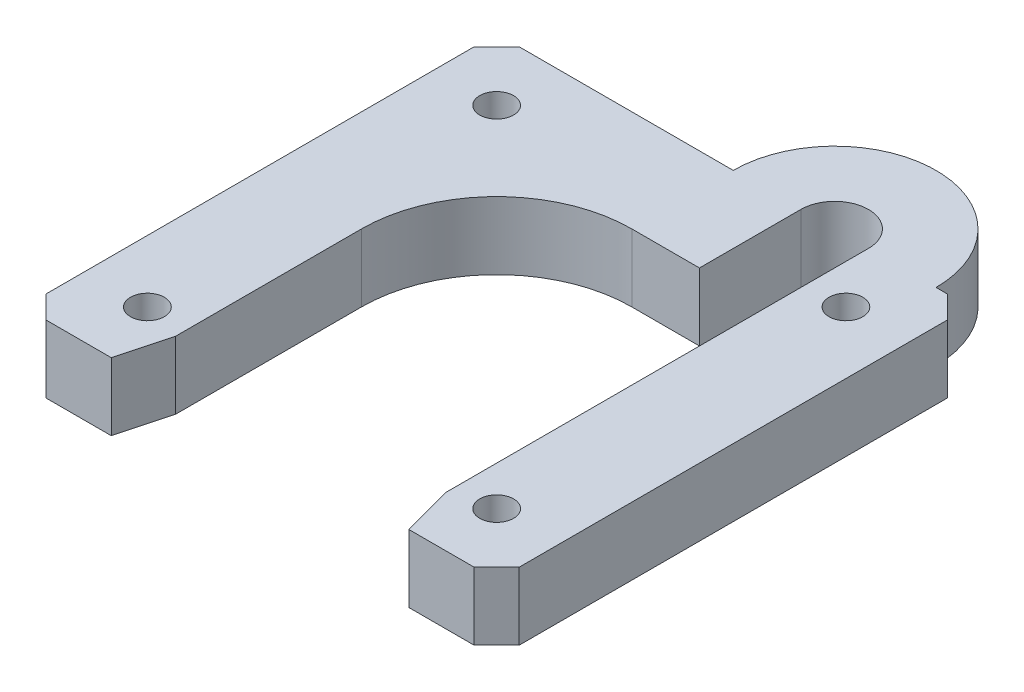
ISO-10303-21;
HEADER;
FILE_DESCRIPTION(('STEP AP214'),'2;1');
FILE_NAME('part.step','',(''),(''),'','','');
FILE_SCHEMA(('AUTOMOTIVE_DESIGN { 1 0 10303 214 1 1 1 1 }'));
ENDSEC;
DATA;
#1=APPLICATION_CONTEXT('core data for automotive mechanical design processes');
#2=APPLICATION_PROTOCOL_DEFINITION('international standard','automotive_design',2000,#1);
#3=PRODUCT_CONTEXT('',#1,'mechanical');
#4=PRODUCT('Part','Part','',(#3));
#5=PRODUCT_RELATED_PRODUCT_CATEGORY('part','',(#4));
#6=PRODUCT_DEFINITION_FORMATION('','',#4);
#7=PRODUCT_DEFINITION_CONTEXT('part definition',#1,'design');
#8=PRODUCT_DEFINITION('design','',#6,#7);
#9=PRODUCT_DEFINITION_SHAPE('','',#8);
#10=(LENGTH_UNIT() NAMED_UNIT(*) SI_UNIT(.MILLI.,.METRE.));
#11=(NAMED_UNIT(*) PLANE_ANGLE_UNIT() SI_UNIT($,.RADIAN.));
#12=(NAMED_UNIT(*) SI_UNIT($,.STERADIAN.) SOLID_ANGLE_UNIT());
#13=UNCERTAINTY_MEASURE_WITH_UNIT(LENGTH_MEASURE(1.E-05),#10,'distance_accuracy_value','');
#14=(GEOMETRIC_REPRESENTATION_CONTEXT(3) GLOBAL_UNCERTAINTY_ASSIGNED_CONTEXT((#13)) GLOBAL_UNIT_ASSIGNED_CONTEXT((#10,
#11,#12)) REPRESENTATION_CONTEXT('',''));
#15=CARTESIAN_POINT('',(0.,0.,0.));
#16=DIRECTION('',(0.,0.,1.));
#17=DIRECTION('',(1.,0.,0.));
#18=AXIS2_PLACEMENT_3D('',#15,#16,#17);
#19=CARTESIAN_POINT('',(-21.,6.,-21.));
#20=DIRECTION('',(0.,0.,1.));
#21=DIRECTION('',(1.,0.,0.));
#22=AXIS2_PLACEMENT_3D('',#19,#20,#21);
#23=PLANE('',#22);
#24=DIRECTION('',(-1.,0.,0.));
#25=VECTOR('',#24,1.);
#26=CARTESIAN_POINT('',(-21.,0.,-21.));
#27=LINE('',#26,#25);
#28=CARTESIAN_POINT('',(19.,0.,-21.));
#29=VERTEX_POINT('',#28);
#30=CARTESIAN_POINT('',(18.,0.,-21.));
#31=VERTEX_POINT('',#30);
#32=EDGE_CURVE('E262',#29,#31,#27,.T.);
#33=ORIENTED_EDGE('',*,*,#32,.T.);
#34=DIRECTION('',(0.,1.,0.));
#35=VECTOR('',#34,1.);
#36=CARTESIAN_POINT('',(18.,-20.1246117974981,-21.));
#37=LINE('',#36,#35);
#38=CARTESIAN_POINT('',(18.,6.,-21.));
#39=VERTEX_POINT('',#38);
#40=EDGE_CURVE('E203',#31,#39,#37,.T.);
#41=ORIENTED_EDGE('',*,*,#40,.T.);
#42=DIRECTION('',(-1.,0.,0.));
#43=VECTOR('',#42,1.);
#44=CARTESIAN_POINT('',(-21.,6.,-21.));
#45=LINE('',#44,#43);
#46=CARTESIAN_POINT('',(19.,6.,-21.));
#47=VERTEX_POINT('',#46);
#48=EDGE_CURVE('E248',#47,#39,#45,.T.);
#49=ORIENTED_EDGE('',*,*,#48,.F.);
#50=DIRECTION('',(0.,-1.,0.));
#51=VECTOR('',#50,1.);
#52=CARTESIAN_POINT('',(19.,6.,-21.));
#53=LINE('',#52,#51);
#54=EDGE_CURVE('E284',#47,#29,#53,.T.);
#55=ORIENTED_EDGE('',*,*,#54,.T.);
#56=EDGE_LOOP('',(#33,#41,#49,#55));
#57=FACE_BOUND('',#56,.T.);
#58=ADVANCED_FACE('F34',(#57),#23,.F.);
#59=CARTESIAN_POINT('',(0.,6.,-21.));
#60=VERTEX_POINT('',#59);
#61=CARTESIAN_POINT('',(-19.,6.,-21.));
#62=VERTEX_POINT('',#61);
#63=EDGE_CURVE('E246',#60,#62,#45,.T.);
#64=ORIENTED_EDGE('',*,*,#63,.F.);
#65=DIRECTION('',(0.,1.,0.));
#66=VECTOR('',#65,1.);
#67=CARTESIAN_POINT('',(0.,-20.1246117974981,-21.));
#68=LINE('',#67,#66);
#69=CARTESIAN_POINT('',(0.,0.,-21.));
#70=VERTEX_POINT('',#69);
#71=EDGE_CURVE('E196',#70,#60,#68,.T.);
#72=ORIENTED_EDGE('',*,*,#71,.F.);
#73=CARTESIAN_POINT('',(-19.,0.,-21.));
#74=VERTEX_POINT('',#73);
#75=EDGE_CURVE('E261',#70,#74,#27,.T.);
#76=ORIENTED_EDGE('',*,*,#75,.T.);
#77=DIRECTION('',(0.,1.,0.));
#78=VECTOR('',#77,1.);
#79=CARTESIAN_POINT('',(-19.,6.,-21.));
#80=LINE('',#79,#78);
#81=EDGE_CURVE('E287',#74,#62,#80,.T.);
#82=ORIENTED_EDGE('',*,*,#81,.T.);
#83=EDGE_LOOP('',(#64,#72,#76,#82));
#84=FACE_BOUND('',#83,.T.);
#85=ADVANCED_FACE('F349',(#84),#23,.F.);
#86=CARTESIAN_POINT('',(-21.,6.,21.));
#87=DIRECTION('',(0.,0.,-1.));
#88=DIRECTION('',(-1.,0.,0.));
#89=AXIS2_PLACEMENT_3D('',#86,#87,#88);
#90=PLANE('',#89);
#91=DIRECTION('',(1.,0.,0.));
#92=VECTOR('',#91,1.);
#93=CARTESIAN_POINT('',(-21.,6.,21.));
#94=LINE('',#93,#92);
#95=CARTESIAN_POINT('',(13.20577136594,6.,21.));
#96=VERTEX_POINT('',#95);
#97=CARTESIAN_POINT('',(19.,6.,21.));
#98=VERTEX_POINT('',#97);
#99=EDGE_CURVE('E254',#96,#98,#94,.T.);
#100=ORIENTED_EDGE('',*,*,#99,.F.);
#101=DIRECTION('',(0.,-1.,0.));
#102=VECTOR('',#101,1.);
#103=CARTESIAN_POINT('',(13.2057713659401,6.,21.));
#104=LINE('',#103,#102);
#105=CARTESIAN_POINT('',(13.2057713659401,0.,21.));
#106=VERTEX_POINT('',#105);
#107=EDGE_CURVE('E315',#96,#106,#104,.T.);
#108=ORIENTED_EDGE('',*,*,#107,.T.);
#109=DIRECTION('',(1.,0.,0.));
#110=VECTOR('',#109,1.);
#111=CARTESIAN_POINT('',(-21.,0.,21.));
#112=LINE('',#111,#110);
#113=CARTESIAN_POINT('',(19.,0.,21.));
#114=VERTEX_POINT('',#113);
#115=EDGE_CURVE('E268',#106,#114,#112,.T.);
#116=ORIENTED_EDGE('',*,*,#115,.T.);
#117=DIRECTION('',(0.,1.,0.));
#118=VECTOR('',#117,1.);
#119=CARTESIAN_POINT('',(19.,6.,21.));
#120=LINE('',#119,#118);
#121=EDGE_CURVE('E306',#114,#98,#120,.T.);
#122=ORIENTED_EDGE('',*,*,#121,.T.);
#123=EDGE_LOOP('',(#100,#108,#116,#122));
#124=FACE_BOUND('',#123,.T.);
#125=ADVANCED_FACE('F394',(#124),#90,.F.);
#126=CARTESIAN_POINT('',(0.,6.,0.));
#127=DIRECTION('',(0.,-1.,0.));
#128=DIRECTION('',(0.,0.,-1.));
#129=AXIS2_PLACEMENT_3D('',#126,#127,#128);
#130=PLANE('',#129);
#131=CARTESIAN_POINT('',(0.,6.,0.));
#132=DIRECTION('',(0.,1.,0.));
#133=DIRECTION('',(0.,0.,1.));
#134=AXIS2_PLACEMENT_3D('',#131,#132,#133);
#135=CIRCLE('',#134,12.);
#136=CARTESIAN_POINT('',(0.,6.,-12.));
#137=VERTEX_POINT('',#136);
#138=CARTESIAN_POINT('',(-12.,6.,0.));
#139=VERTEX_POINT('',#138);
#140=EDGE_CURVE('E239',#137,#139,#135,.T.);
#141=ORIENTED_EDGE('',*,*,#140,.F.);
#142=DIRECTION('',(-1.,0.,0.));
#143=VECTOR('',#142,1.);
#144=CARTESIAN_POINT('',(0.,6.,-12.));
#145=LINE('',#144,#143);
#146=CARTESIAN_POINT('',(6.,6.,-12.));
#147=VERTEX_POINT('',#146);
#148=EDGE_CURVE('E361',#147,#137,#145,.T.);
#149=ORIENTED_EDGE('',*,*,#148,.F.);
#150=DIRECTION('',(0.,0.,1.));
#151=VECTOR('',#150,1.);
#152=CARTESIAN_POINT('',(6.,6.,-21.));
#153=LINE('',#152,#151);
#154=CARTESIAN_POINT('',(6.,6.,-21.));
#155=VERTEX_POINT('',#154);
#156=EDGE_CURVE('E364',#155,#147,#153,.T.);
#157=ORIENTED_EDGE('',*,*,#156,.F.);
#158=CARTESIAN_POINT('',(9.,6.,-21.));
#159=DIRECTION('',(0.,-1.,0.));
#160=DIRECTION('',(0.,0.,1.));
#161=AXIS2_PLACEMENT_3D('',#158,#159,#160);
#162=CIRCLE('',#161,3.);
#163=CARTESIAN_POINT('',(12.,6.,-21.));
#164=VERTEX_POINT('',#163);
#165=EDGE_CURVE('E200',#155,#164,#162,.T.);
#166=ORIENTED_EDGE('',*,*,#165,.T.);
#167=DIRECTION('',(0.,0.,-1.));
#168=VECTOR('',#167,1.);
#169=CARTESIAN_POINT('',(12.,6.,21.));
#170=LINE('',#169,#168);
#171=CARTESIAN_POINT('',(12.,6.,16.4999999999999));
#172=VERTEX_POINT('',#171);
#173=EDGE_CURVE('E187',#172,#164,#170,.T.);
#174=ORIENTED_EDGE('',*,*,#173,.F.);
#175=DIRECTION('',(-0.258819045102518,0.,-0.965925826289069));
#176=VECTOR('',#175,1.);
#177=CARTESIAN_POINT('',(12.,6.,16.4999999999999));
#178=LINE('',#177,#176);
#179=EDGE_CURVE('E313',#172,#96,#178,.F.);
#180=ORIENTED_EDGE('',*,*,#179,.T.);
#181=ORIENTED_EDGE('',*,*,#99,.T.);
#182=DIRECTION('',(-0.707106781186549,0.,0.707106781186546));
#183=VECTOR('',#182,1.);
#184=CARTESIAN_POINT('',(21.,6.,18.9999999999999));
#185=LINE('',#184,#183);
#186=CARTESIAN_POINT('',(21.,6.,18.9999999999999));
#187=VERTEX_POINT('',#186);
#188=EDGE_CURVE('E292',#98,#187,#185,.F.);
#189=ORIENTED_EDGE('',*,*,#188,.T.);
#190=DIRECTION('',(0.,0.,-1.));
#191=VECTOR('',#190,1.);
#192=CARTESIAN_POINT('',(21.,6.,21.));
#193=LINE('',#192,#191);
#194=CARTESIAN_POINT('',(21.,6.,-18.9999999999999));
#195=VERTEX_POINT('',#194);
#196=EDGE_CURVE('E243',#187,#195,#193,.T.);
#197=ORIENTED_EDGE('',*,*,#196,.T.);
#198=DIRECTION('',(0.707106781186546,0.,0.707106781186549));
#199=VECTOR('',#198,1.);
#200=CARTESIAN_POINT('',(19.,6.,-21.));
#201=LINE('',#200,#199);
#202=EDGE_CURVE('E294',#195,#47,#201,.F.);
#203=ORIENTED_EDGE('',*,*,#202,.T.);
#204=ORIENTED_EDGE('',*,*,#48,.T.);
#205=CARTESIAN_POINT('',(9.,6.,-21.));
#206=DIRECTION('',(0.,1.,0.));
#207=DIRECTION('',(0.,0.,-1.));
#208=AXIS2_PLACEMENT_3D('',#205,#206,#207);
#209=CIRCLE('',#208,9.);
#210=EDGE_CURVE('E207',#39,#60,#209,.T.);
#211=ORIENTED_EDGE('',*,*,#210,.T.);
#212=ORIENTED_EDGE('',*,*,#63,.T.);
#213=DIRECTION('',(0.707106781186548,0.,-0.707106781186547));
#214=VECTOR('',#213,1.);
#215=CARTESIAN_POINT('',(-21.,6.,-19.));
#216=LINE('',#215,#214);
#217=CARTESIAN_POINT('',(-21.,6.,-19.));
#218=VERTEX_POINT('',#217);
#219=EDGE_CURVE('E296',#62,#218,#216,.F.);
#220=ORIENTED_EDGE('',*,*,#219,.T.);
#221=DIRECTION('',(0.,0.,1.));
#222=VECTOR('',#221,1.);
#223=CARTESIAN_POINT('',(-21.,6.,21.));
#224=LINE('',#223,#222);
#225=CARTESIAN_POINT('',(-21.,6.,18.9999999999999));
#226=VERTEX_POINT('',#225);
#227=EDGE_CURVE('E251',#218,#226,#224,.T.);
#228=ORIENTED_EDGE('',*,*,#227,.T.);
#229=DIRECTION('',(-0.707106781186546,0.,-0.707106781186549));
#230=VECTOR('',#229,1.);
#231=CARTESIAN_POINT('',(-19.,6.,21.));
#232=LINE('',#231,#230);
#233=CARTESIAN_POINT('',(-19.,6.,21.));
#234=VERTEX_POINT('',#233);
#235=EDGE_CURVE('E290',#226,#234,#232,.F.);
#236=ORIENTED_EDGE('',*,*,#235,.T.);
#237=CARTESIAN_POINT('',(-13.2057713659401,6.,21.));
#238=VERTEX_POINT('',#237);
#239=EDGE_CURVE('E255',#234,#238,#94,.T.);
#240=ORIENTED_EDGE('',*,*,#239,.T.);
#241=DIRECTION('',(-0.258819045102518,0.,0.965925826289069));
#242=VECTOR('',#241,1.);
#243=CARTESIAN_POINT('',(-13.2057713659401,6.,21.));
#244=LINE('',#243,#242);
#245=CARTESIAN_POINT('',(-12.,6.,16.4999999999999));
#246=VERTEX_POINT('',#245);
#247=EDGE_CURVE('E311',#238,#246,#244,.F.);
#248=ORIENTED_EDGE('',*,*,#247,.T.);
#249=DIRECTION('',(0.,0.,1.));
#250=VECTOR('',#249,1.);
#251=CARTESIAN_POINT('',(-12.,6.,0.));
#252=LINE('',#251,#250);
#253=EDGE_CURVE('E191',#139,#246,#252,.T.);
#254=ORIENTED_EDGE('',*,*,#253,.F.);
#255=EDGE_LOOP('',(#141,#149,#157,#166,#174,#180,#181,#189,#197,#203,#204,#211,#212,#220,#228,
#236,#240,#248,#254));
#256=FACE_BOUND('',#255,.T.);
#257=CARTESIAN_POINT('',(-15.5,6.,-15.5));
#258=DIRECTION('',(0.,1.,0.));
#259=DIRECTION('',(0.,0.,1.));
#260=AXIS2_PLACEMENT_3D('',#257,#258,#259);
#261=CIRCLE('',#260,1.5);
#262=CARTESIAN_POINT('',(-15.5,6.,-14.));
#263=VERTEX_POINT('',#262);
#264=EDGE_CURVE('E233',#263,#263,#261,.T.);
#265=ORIENTED_EDGE('',*,*,#264,.F.);
#266=EDGE_LOOP('',(#265));
#267=FACE_BOUND('',#266,.T.);
#268=CARTESIAN_POINT('',(15.5,6.,-15.5));
#269=DIRECTION('',(0.,1.,0.));
#270=DIRECTION('',(0.,0.,1.));
#271=AXIS2_PLACEMENT_3D('',#268,#269,#270);
#272=CIRCLE('',#271,1.5);
#273=CARTESIAN_POINT('',(15.5,6.,-14.));
#274=VERTEX_POINT('',#273);
#275=EDGE_CURVE('E227',#274,#274,#272,.T.);
#276=ORIENTED_EDGE('',*,*,#275,.F.);
#277=EDGE_LOOP('',(#276));
#278=FACE_BOUND('',#277,.T.);
#279=CARTESIAN_POINT('',(15.5,6.,15.5));
#280=DIRECTION('',(0.,1.,0.));
#281=DIRECTION('',(0.,0.,1.));
#282=AXIS2_PLACEMENT_3D('',#279,#280,#281);
#283=CIRCLE('',#282,1.5);
#284=CARTESIAN_POINT('',(15.5,6.,17.));
#285=VERTEX_POINT('',#284);
#286=EDGE_CURVE('E221',#285,#285,#283,.T.);
#287=ORIENTED_EDGE('',*,*,#286,.F.);
#288=EDGE_LOOP('',(#287));
#289=FACE_BOUND('',#288,.T.);
#290=CARTESIAN_POINT('',(-15.5,6.,15.5));
#291=DIRECTION('',(0.,1.,0.));
#292=DIRECTION('',(0.,0.,1.));
#293=AXIS2_PLACEMENT_3D('',#290,#291,#292);
#294=CIRCLE('',#293,1.5);
#295=CARTESIAN_POINT('',(-15.5,6.,17.));
#296=VERTEX_POINT('',#295);
#297=EDGE_CURVE('E215',#296,#296,#294,.T.);
#298=ORIENTED_EDGE('',*,*,#297,.F.);
#299=EDGE_LOOP('',(#298));
#300=FACE_BOUND('',#299,.T.);
#301=ADVANCED_FACE('F327',(#256,#267,#278,#289,#300),#130,.F.);
#302=CARTESIAN_POINT('',(0.,0.,0.));
#303=DIRECTION('',(0.,-1.,0.));
#304=DIRECTION('',(0.,0.,-1.));
#305=AXIS2_PLACEMENT_3D('',#302,#303,#304);
#306=PLANE('',#305);
#307=DIRECTION('',(-1.,0.,0.));
#308=VECTOR('',#307,1.);
#309=CARTESIAN_POINT('',(0.,0.,-12.));
#310=LINE('',#309,#308);
#311=CARTESIAN_POINT('',(6.,0.,-12.));
#312=VERTEX_POINT('',#311);
#313=CARTESIAN_POINT('',(0.,0.,-12.));
#314=VERTEX_POINT('',#313);
#315=EDGE_CURVE('E358',#312,#314,#310,.T.);
#316=ORIENTED_EDGE('',*,*,#315,.T.);
#317=CARTESIAN_POINT('',(0.,0.,0.));
#318=DIRECTION('',(0.,1.,0.));
#319=DIRECTION('',(0.,0.,1.));
#320=AXIS2_PLACEMENT_3D('',#317,#318,#319);
#321=CIRCLE('',#320,12.);
#322=CARTESIAN_POINT('',(-12.,0.,0.));
#323=VERTEX_POINT('',#322);
#324=EDGE_CURVE('E236',#314,#323,#321,.T.);
#325=ORIENTED_EDGE('',*,*,#324,.T.);
#326=DIRECTION('',(0.,0.,1.));
#327=VECTOR('',#326,1.);
#328=CARTESIAN_POINT('',(-12.,0.,0.));
#329=LINE('',#328,#327);
#330=CARTESIAN_POINT('',(-12.,0.,16.4999999999999));
#331=VERTEX_POINT('',#330);
#332=EDGE_CURVE('E181',#323,#331,#329,.T.);
#333=ORIENTED_EDGE('',*,*,#332,.T.);
#334=DIRECTION('',(0.258819045102518,0.,-0.965925826289069));
#335=VECTOR('',#334,1.);
#336=CARTESIAN_POINT('',(-7.07115242270671,0.,-1.89470958122162));
#337=LINE('',#336,#335);
#338=CARTESIAN_POINT('',(-13.2057713659401,0.,21.));
#339=VERTEX_POINT('',#338);
#340=EDGE_CURVE('E49',#331,#339,#337,.F.);
#341=ORIENTED_EDGE('',*,*,#340,.T.);
#342=CARTESIAN_POINT('',(-19.,0.,21.));
#343=VERTEX_POINT('',#342);
#344=EDGE_CURVE('E247',#343,#339,#112,.T.);
#345=ORIENTED_EDGE('',*,*,#344,.F.);
#346=DIRECTION('',(0.707106781186546,0.,0.707106781186549));
#347=VECTOR('',#346,1.);
#348=CARTESIAN_POINT('',(-20.,0.,19.9999999999999));
#349=LINE('',#348,#347);
#350=CARTESIAN_POINT('',(-21.,0.,18.9999999999999));
#351=VERTEX_POINT('',#350);
#352=EDGE_CURVE('E274',#343,#351,#349,.F.);
#353=ORIENTED_EDGE('',*,*,#352,.T.);
#354=DIRECTION('',(0.,0.,1.));
#355=VECTOR('',#354,1.);
#356=CARTESIAN_POINT('',(-21.,0.,21.));
#357=LINE('',#356,#355);
#358=CARTESIAN_POINT('',(-21.,0.,-19.));
#359=VERTEX_POINT('',#358);
#360=EDGE_CURVE('E265',#359,#351,#357,.T.);
#361=ORIENTED_EDGE('',*,*,#360,.F.);
#362=DIRECTION('',(-0.707106781186548,0.,0.707106781186547));
#363=VECTOR('',#362,1.);
#364=CARTESIAN_POINT('',(-20.,0.,-20.));
#365=LINE('',#364,#363);
#366=EDGE_CURVE('E281',#359,#74,#365,.F.);
#367=ORIENTED_EDGE('',*,*,#366,.T.);
#368=ORIENTED_EDGE('',*,*,#75,.F.);
#369=CARTESIAN_POINT('',(9.,0.,-21.));
#370=DIRECTION('',(0.,-1.,0.));
#371=DIRECTION('',(0.,0.,-1.));
#372=AXIS2_PLACEMENT_3D('',#369,#370,#371);
#373=CIRCLE('',#372,9.);
#374=EDGE_CURVE('E202',#31,#70,#373,.F.);
#375=ORIENTED_EDGE('',*,*,#374,.F.);
#376=ORIENTED_EDGE('',*,*,#32,.F.);
#377=DIRECTION('',(-0.707106781186546,0.,-0.707106781186549));
#378=VECTOR('',#377,1.);
#379=CARTESIAN_POINT('',(20.,0.,-20.));
#380=LINE('',#379,#378);
#381=CARTESIAN_POINT('',(21.,0.,-19.));
#382=VERTEX_POINT('',#381);
#383=EDGE_CURVE('E279',#29,#382,#380,.F.);
#384=ORIENTED_EDGE('',*,*,#383,.T.);
#385=DIRECTION('',(0.,0.,-1.));
#386=VECTOR('',#385,1.);
#387=CARTESIAN_POINT('',(21.,0.,21.));
#388=LINE('',#387,#386);
#389=CARTESIAN_POINT('',(21.,0.,19.));
#390=VERTEX_POINT('',#389);
#391=EDGE_CURVE('E241',#390,#382,#388,.T.);
#392=ORIENTED_EDGE('',*,*,#391,.F.);
#393=DIRECTION('',(0.707106781186549,0.,-0.707106781186546));
#394=VECTOR('',#393,1.);
#395=CARTESIAN_POINT('',(19.9999999999999,0.,20.));
#396=LINE('',#395,#394);
#397=EDGE_CURVE('E276',#390,#114,#396,.F.);
#398=ORIENTED_EDGE('',*,*,#397,.T.);
#399=ORIENTED_EDGE('',*,*,#115,.F.);
#400=DIRECTION('',(0.258819045102518,0.,0.965925826289069));
#401=VECTOR('',#400,1.);
#402=CARTESIAN_POINT('',(7.07115242270671,0.,-1.89470958122162));
#403=LINE('',#402,#401);
#404=CARTESIAN_POINT('',(12.,0.,16.5));
#405=VERTEX_POINT('',#404);
#406=EDGE_CURVE('E176',#106,#405,#403,.F.);
#407=ORIENTED_EDGE('',*,*,#406,.T.);
#408=DIRECTION('',(0.,0.,-1.));
#409=VECTOR('',#408,1.);
#410=CARTESIAN_POINT('',(12.,0.,21.));
#411=LINE('',#410,#409);
#412=CARTESIAN_POINT('',(12.,0.,-21.));
#413=VERTEX_POINT('',#412);
#414=EDGE_CURVE('E165',#405,#413,#411,.T.);
#415=ORIENTED_EDGE('',*,*,#414,.T.);
#416=CARTESIAN_POINT('',(9.,0.,-21.));
#417=DIRECTION('',(0.,-1.,0.));
#418=DIRECTION('',(0.,0.,-1.));
#419=AXIS2_PLACEMENT_3D('',#416,#417,#418);
#420=CIRCLE('',#419,3.);
#421=CARTESIAN_POINT('',(6.,0.,-21.));
#422=VERTEX_POINT('',#421);
#423=EDGE_CURVE('E172',#422,#413,#420,.T.);
#424=ORIENTED_EDGE('',*,*,#423,.F.);
#425=DIRECTION('',(0.,0.,1.));
#426=VECTOR('',#425,1.);
#427=CARTESIAN_POINT('',(6.,0.,-21.));
#428=LINE('',#427,#426);
#429=EDGE_CURVE('E363',#422,#312,#428,.T.);
#430=ORIENTED_EDGE('',*,*,#429,.T.);
#431=EDGE_LOOP('',(#316,#325,#333,#341,#345,#353,#361,#367,#368,#375,#376,#384,#392,#398,#399,
#407,#415,#424,#430));
#432=FACE_BOUND('',#431,.T.);
#433=CARTESIAN_POINT('',(15.5,0.,15.5));
#434=DIRECTION('',(0.,1.,0.));
#435=DIRECTION('',(0.,0.,1.));
#436=AXIS2_PLACEMENT_3D('',#433,#434,#435);
#437=CIRCLE('',#436,1.5);
#438=CARTESIAN_POINT('',(15.5,0.,17.));
#439=VERTEX_POINT('',#438);
#440=EDGE_CURVE('E218',#439,#439,#437,.T.);
#441=ORIENTED_EDGE('',*,*,#440,.T.);
#442=EDGE_LOOP('',(#441));
#443=FACE_BOUND('',#442,.T.);
#444=CARTESIAN_POINT('',(-15.5,0.,-15.5));
#445=DIRECTION('',(0.,1.,0.));
#446=DIRECTION('',(0.,0.,1.));
#447=AXIS2_PLACEMENT_3D('',#444,#445,#446);
#448=CIRCLE('',#447,1.5);
#449=CARTESIAN_POINT('',(-15.5,0.,-14.));
#450=VERTEX_POINT('',#449);
#451=EDGE_CURVE('E230',#450,#450,#448,.T.);
#452=ORIENTED_EDGE('',*,*,#451,.T.);
#453=EDGE_LOOP('',(#452));
#454=FACE_BOUND('',#453,.T.);
#455=CARTESIAN_POINT('',(15.5,0.,-15.5));
#456=DIRECTION('',(0.,1.,0.));
#457=DIRECTION('',(0.,0.,1.));
#458=AXIS2_PLACEMENT_3D('',#455,#456,#457);
#459=CIRCLE('',#458,1.5);
#460=CARTESIAN_POINT('',(15.5,0.,-14.));
#461=VERTEX_POINT('',#460);
#462=EDGE_CURVE('E224',#461,#461,#459,.T.);
#463=ORIENTED_EDGE('',*,*,#462,.T.);
#464=EDGE_LOOP('',(#463));
#465=FACE_BOUND('',#464,.T.);
#466=CARTESIAN_POINT('',(-15.5,0.,15.5));
#467=DIRECTION('',(0.,1.,0.));
#468=DIRECTION('',(0.,0.,1.));
#469=AXIS2_PLACEMENT_3D('',#466,#467,#468);
#470=CIRCLE('',#469,1.5);
#471=CARTESIAN_POINT('',(-15.5,0.,17.));
#472=VERTEX_POINT('',#471);
#473=EDGE_CURVE('E214',#472,#472,#470,.T.);
#474=ORIENTED_EDGE('',*,*,#473,.T.);
#475=EDGE_LOOP('',(#474));
#476=FACE_BOUND('',#475,.T.);
#477=ADVANCED_FACE('F168',(#432,#443,#454,#465,#476),#306,.T.);
#478=CARTESIAN_POINT('',(21.,6.,21.));
#479=DIRECTION('',(-1.,0.,0.));
#480=DIRECTION('',(0.,0.,1.));
#481=AXIS2_PLACEMENT_3D('',#478,#479,#480);
#482=PLANE('',#481);
#483=ORIENTED_EDGE('',*,*,#391,.T.);
#484=DIRECTION('',(0.,1.,0.));
#485=VECTOR('',#484,1.);
#486=CARTESIAN_POINT('',(21.,6.,-19.));
#487=LINE('',#486,#485);
#488=EDGE_CURVE('E301',#382,#195,#487,.T.);
#489=ORIENTED_EDGE('',*,*,#488,.T.);
#490=ORIENTED_EDGE('',*,*,#196,.F.);
#491=DIRECTION('',(0.,-1.,0.));
#492=VECTOR('',#491,1.);
#493=CARTESIAN_POINT('',(21.,6.,18.9999999999999));
#494=LINE('',#493,#492);
#495=EDGE_CURVE('E298',#187,#390,#494,.T.);
#496=ORIENTED_EDGE('',*,*,#495,.T.);
#497=EDGE_LOOP('',(#483,#489,#490,#496));
#498=FACE_BOUND('',#497,.T.);
#499=ADVANCED_FACE('F398',(#498),#482,.F.);
#500=CARTESIAN_POINT('',(-21.,6.,21.));
#501=DIRECTION('',(1.,0.,0.));
#502=DIRECTION('',(0.,0.,-1.));
#503=AXIS2_PLACEMENT_3D('',#500,#501,#502);
#504=PLANE('',#503);
#505=ORIENTED_EDGE('',*,*,#227,.F.);
#506=DIRECTION('',(0.,-1.,0.));
#507=VECTOR('',#506,1.);
#508=CARTESIAN_POINT('',(-21.,6.,-19.));
#509=LINE('',#508,#507);
#510=EDGE_CURVE('E271',#218,#359,#509,.T.);
#511=ORIENTED_EDGE('',*,*,#510,.T.);
#512=ORIENTED_EDGE('',*,*,#360,.T.);
#513=DIRECTION('',(0.,1.,0.));
#514=VECTOR('',#513,1.);
#515=CARTESIAN_POINT('',(-21.,6.,18.9999999999999));
#516=LINE('',#515,#514);
#517=EDGE_CURVE('E258',#351,#226,#516,.T.);
#518=ORIENTED_EDGE('',*,*,#517,.T.);
#519=EDGE_LOOP('',(#505,#511,#512,#518));
#520=FACE_BOUND('',#519,.T.);
#521=ADVANCED_FACE('F337',(#520),#504,.F.);
#522=ORIENTED_EDGE('',*,*,#344,.T.);
#523=DIRECTION('',(0.,1.,0.));
#524=VECTOR('',#523,1.);
#525=CARTESIAN_POINT('',(-13.2057713659401,6.,21.));
#526=LINE('',#525,#524);
#527=EDGE_CURVE('E42',#339,#238,#526,.T.);
#528=ORIENTED_EDGE('',*,*,#527,.T.);
#529=ORIENTED_EDGE('',*,*,#239,.F.);
#530=DIRECTION('',(0.,-1.,0.));
#531=VECTOR('',#530,1.);
#532=CARTESIAN_POINT('',(-19.,6.,21.));
#533=LINE('',#532,#531);
#534=EDGE_CURVE('E303',#234,#343,#533,.T.);
#535=ORIENTED_EDGE('',*,*,#534,.T.);
#536=EDGE_LOOP('',(#522,#528,#529,#535));
#537=FACE_BOUND('',#536,.T.);
#538=ADVANCED_FACE('F322',(#537),#90,.F.);
#539=CARTESIAN_POINT('',(0.,6.,0.));
#540=DIRECTION('',(0.,-1.,0.));
#541=DIRECTION('',(0.,0.,-1.));
#542=AXIS2_PLACEMENT_3D('',#539,#540,#541);
#543=CYLINDRICAL_SURFACE('',#542,12.);
#544=DIRECTION('',(0.,1.,0.));
#545=VECTOR('',#544,1.);
#546=CARTESIAN_POINT('',(0.,0.,-12.));
#547=LINE('',#546,#545);
#548=EDGE_CURVE('E354',#314,#137,#547,.T.);
#549=ORIENTED_EDGE('',*,*,#548,.T.);
#550=ORIENTED_EDGE('',*,*,#140,.T.);
#551=DIRECTION('',(0.,1.,0.));
#552=VECTOR('',#551,1.);
#553=CARTESIAN_POINT('',(-12.,0.,0.));
#554=LINE('',#553,#552);
#555=EDGE_CURVE('E180',#323,#139,#554,.T.);
#556=ORIENTED_EDGE('',*,*,#555,.F.);
#557=ORIENTED_EDGE('',*,*,#324,.F.);
#558=EDGE_LOOP('',(#549,#550,#556,#557));
#559=FACE_BOUND('',#558,.T.);
#560=ADVANCED_FACE('F377',(#559),#543,.F.);
#561=CARTESIAN_POINT('',(-15.5,6.,-15.5));
#562=DIRECTION('',(0.,-1.,0.));
#563=DIRECTION('',(0.,0.,-1.));
#564=AXIS2_PLACEMENT_3D('',#561,#562,#563);
#565=CYLINDRICAL_SURFACE('',#564,1.5);
#566=ORIENTED_EDGE('',*,*,#264,.T.);
#567=EDGE_LOOP('',(#566));
#568=FACE_BOUND('',#567,.T.);
#569=ORIENTED_EDGE('',*,*,#451,.F.);
#570=EDGE_LOOP('',(#569));
#571=FACE_BOUND('',#570,.T.);
#572=ADVANCED_FACE('F433',(#568,#571),#565,.F.);
#573=CARTESIAN_POINT('',(15.5,6.,-15.5));
#574=DIRECTION('',(0.,-1.,0.));
#575=DIRECTION('',(0.,0.,-1.));
#576=AXIS2_PLACEMENT_3D('',#573,#574,#575);
#577=CYLINDRICAL_SURFACE('',#576,1.5);
#578=ORIENTED_EDGE('',*,*,#275,.T.);
#579=EDGE_LOOP('',(#578));
#580=FACE_BOUND('',#579,.T.);
#581=ORIENTED_EDGE('',*,*,#462,.F.);
#582=EDGE_LOOP('',(#581));
#583=FACE_BOUND('',#582,.T.);
#584=ADVANCED_FACE('F429',(#580,#583),#577,.F.);
#585=CARTESIAN_POINT('',(15.5,6.,15.5));
#586=DIRECTION('',(0.,-1.,0.));
#587=DIRECTION('',(0.,0.,-1.));
#588=AXIS2_PLACEMENT_3D('',#585,#586,#587);
#589=CYLINDRICAL_SURFACE('',#588,1.5);
#590=ORIENTED_EDGE('',*,*,#286,.T.);
#591=EDGE_LOOP('',(#590));
#592=FACE_BOUND('',#591,.T.);
#593=ORIENTED_EDGE('',*,*,#440,.F.);
#594=EDGE_LOOP('',(#593));
#595=FACE_BOUND('',#594,.T.);
#596=ADVANCED_FACE('F425',(#592,#595),#589,.F.);
#597=CARTESIAN_POINT('',(-15.5,6.,15.5));
#598=DIRECTION('',(0.,-1.,0.));
#599=DIRECTION('',(0.,0.,-1.));
#600=AXIS2_PLACEMENT_3D('',#597,#598,#599);
#601=CYLINDRICAL_SURFACE('',#600,1.5);
#602=ORIENTED_EDGE('',*,*,#297,.T.);
#603=EDGE_LOOP('',(#602));
#604=FACE_BOUND('',#603,.T.);
#605=ORIENTED_EDGE('',*,*,#473,.F.);
#606=EDGE_LOOP('',(#605));
#607=FACE_BOUND('',#606,.T.);
#608=ADVANCED_FACE('F405',(#604,#607),#601,.F.);
#609=CARTESIAN_POINT('',(-21.,6.,-19.));
#610=DIRECTION('',(0.707106781186547,0.,0.707106781186548));
#611=DIRECTION('',(0.,-1.,0.));
#612=AXIS2_PLACEMENT_3D('',#609,#610,#611);
#613=PLANE('',#612);
#614=ORIENTED_EDGE('',*,*,#219,.F.);
#615=ORIENTED_EDGE('',*,*,#81,.F.);
#616=ORIENTED_EDGE('',*,*,#366,.F.);
#617=ORIENTED_EDGE('',*,*,#510,.F.);
#618=EDGE_LOOP('',(#614,#615,#616,#617));
#619=FACE_BOUND('',#618,.T.);
#620=ADVANCED_FACE('F341',(#619),#613,.F.);
#621=CARTESIAN_POINT('',(19.,6.,-21.));
#622=DIRECTION('',(-0.707106781186549,0.,0.707106781186546));
#623=DIRECTION('',(0.,-1.,0.));
#624=AXIS2_PLACEMENT_3D('',#621,#622,#623);
#625=PLANE('',#624);
#626=ORIENTED_EDGE('',*,*,#202,.F.);
#627=ORIENTED_EDGE('',*,*,#488,.F.);
#628=ORIENTED_EDGE('',*,*,#383,.F.);
#629=ORIENTED_EDGE('',*,*,#54,.F.);
#630=EDGE_LOOP('',(#626,#627,#628,#629));
#631=FACE_BOUND('',#630,.T.);
#632=ADVANCED_FACE('F404',(#631),#625,.F.);
#633=CARTESIAN_POINT('',(21.,6.,18.9999999999999));
#634=DIRECTION('',(-0.707106781186546,0.,-0.707106781186549));
#635=DIRECTION('',(0.,-1.,0.));
#636=AXIS2_PLACEMENT_3D('',#633,#634,#635);
#637=PLANE('',#636);
#638=ORIENTED_EDGE('',*,*,#188,.F.);
#639=ORIENTED_EDGE('',*,*,#121,.F.);
#640=ORIENTED_EDGE('',*,*,#397,.F.);
#641=ORIENTED_EDGE('',*,*,#495,.F.);
#642=EDGE_LOOP('',(#638,#639,#640,#641));
#643=FACE_BOUND('',#642,.T.);
#644=ADVANCED_FACE('F408',(#643),#637,.F.);
#645=CARTESIAN_POINT('',(-19.,6.,21.));
#646=DIRECTION('',(0.707106781186549,0.,-0.707106781186546));
#647=DIRECTION('',(0.,-1.,0.));
#648=AXIS2_PLACEMENT_3D('',#645,#646,#647);
#649=PLANE('',#648);
#650=ORIENTED_EDGE('',*,*,#235,.F.);
#651=ORIENTED_EDGE('',*,*,#517,.F.);
#652=ORIENTED_EDGE('',*,*,#352,.F.);
#653=ORIENTED_EDGE('',*,*,#534,.F.);
#654=EDGE_LOOP('',(#650,#651,#652,#653));
#655=FACE_BOUND('',#654,.T.);
#656=ADVANCED_FACE('F334',(#655),#649,.F.);
#657=CARTESIAN_POINT('',(-12.,0.,0.));
#658=DIRECTION('',(-1.,0.,0.));
#659=DIRECTION('',(0.,0.,1.));
#660=AXIS2_PLACEMENT_3D('',#657,#658,#659);
#661=PLANE('',#660);
#662=ORIENTED_EDGE('',*,*,#253,.T.);
#663=DIRECTION('',(0.,-1.,0.));
#664=VECTOR('',#663,1.);
#665=CARTESIAN_POINT('',(-12.,0.,16.4999999999999));
#666=LINE('',#665,#664);
#667=EDGE_CURVE('E11',#246,#331,#666,.T.);
#668=ORIENTED_EDGE('',*,*,#667,.T.);
#669=ORIENTED_EDGE('',*,*,#332,.F.);
#670=ORIENTED_EDGE('',*,*,#555,.T.);
#671=EDGE_LOOP('',(#662,#668,#669,#670));
#672=FACE_BOUND('',#671,.T.);
#673=ADVANCED_FACE('F379',(#672),#661,.F.);
#674=CARTESIAN_POINT('',(12.,0.,21.));
#675=DIRECTION('',(1.,0.,0.));
#676=DIRECTION('',(0.,0.,-1.));
#677=AXIS2_PLACEMENT_3D('',#674,#675,#676);
#678=PLANE('',#677);
#679=ORIENTED_EDGE('',*,*,#414,.F.);
#680=DIRECTION('',(0.,1.,0.));
#681=VECTOR('',#680,1.);
#682=CARTESIAN_POINT('',(12.,0.,16.4999999999999));
#683=LINE('',#682,#681);
#684=EDGE_CURVE('E309',#405,#172,#683,.T.);
#685=ORIENTED_EDGE('',*,*,#684,.T.);
#686=ORIENTED_EDGE('',*,*,#173,.T.);
#687=DIRECTION('',(0.,1.,0.));
#688=VECTOR('',#687,1.);
#689=CARTESIAN_POINT('',(12.,-20.1246117974981,-21.));
#690=LINE('',#689,#688);
#691=EDGE_CURVE('E184',#413,#164,#690,.T.);
#692=ORIENTED_EDGE('',*,*,#691,.F.);
#693=EDGE_LOOP('',(#679,#685,#686,#692));
#694=FACE_BOUND('',#693,.T.);
#695=ADVANCED_FACE('F185',(#694),#678,.F.);
#696=CARTESIAN_POINT('',(12.,0.,16.4999999999999));
#697=DIRECTION('',(0.965925826289069,0.,-0.258819045102518));
#698=DIRECTION('',(0.,1.,0.));
#699=AXIS2_PLACEMENT_3D('',#696,#697,#698);
#700=PLANE('',#699);
#701=ORIENTED_EDGE('',*,*,#406,.F.);
#702=ORIENTED_EDGE('',*,*,#107,.F.);
#703=ORIENTED_EDGE('',*,*,#179,.F.);
#704=ORIENTED_EDGE('',*,*,#684,.F.);
#705=EDGE_LOOP('',(#701,#702,#703,#704));
#706=FACE_BOUND('',#705,.T.);
#707=ADVANCED_FACE('F381',(#706),#700,.F.);
#708=CARTESIAN_POINT('',(-13.2057713659401,6.,21.));
#709=DIRECTION('',(-0.965925826289069,0.,-0.258819045102518));
#710=DIRECTION('',(0.,1.,0.));
#711=AXIS2_PLACEMENT_3D('',#708,#709,#710);
#712=PLANE('',#711);
#713=ORIENTED_EDGE('',*,*,#340,.F.);
#714=ORIENTED_EDGE('',*,*,#667,.F.);
#715=ORIENTED_EDGE('',*,*,#247,.F.);
#716=ORIENTED_EDGE('',*,*,#527,.F.);
#717=EDGE_LOOP('',(#713,#714,#715,#716));
#718=FACE_BOUND('',#717,.T.);
#719=ADVANCED_FACE('F36',(#718),#712,.F.);
#720=CARTESIAN_POINT('',(9.,-20.1246117974981,-21.));
#721=DIRECTION('',(0.,1.,0.));
#722=DIRECTION('',(0.,0.,1.));
#723=AXIS2_PLACEMENT_3D('',#720,#721,#722);
#724=CYLINDRICAL_SURFACE('',#723,9.);
#725=ORIENTED_EDGE('',*,*,#40,.F.);
#726=ORIENTED_EDGE('',*,*,#374,.T.);
#727=ORIENTED_EDGE('',*,*,#71,.T.);
#728=ORIENTED_EDGE('',*,*,#210,.F.);
#729=EDGE_LOOP('',(#725,#726,#727,#728));
#730=FACE_BOUND('',#729,.T.);
#731=ADVANCED_FACE('F352',(#730),#724,.T.);
#732=CARTESIAN_POINT('',(9.,-20.1246117974981,-21.));
#733=DIRECTION('',(0.,1.,0.));
#734=DIRECTION('',(0.,0.,1.));
#735=AXIS2_PLACEMENT_3D('',#732,#733,#734);
#736=CYLINDRICAL_SURFACE('',#735,3.);
#737=DIRECTION('',(0.,1.,0.));
#738=VECTOR('',#737,1.);
#739=CARTESIAN_POINT('',(6.,-20.1246117974981,-21.));
#740=LINE('',#739,#738);
#741=EDGE_CURVE('E194',#422,#155,#740,.T.);
#742=ORIENTED_EDGE('',*,*,#741,.F.);
#743=ORIENTED_EDGE('',*,*,#423,.T.);
#744=ORIENTED_EDGE('',*,*,#691,.T.);
#745=ORIENTED_EDGE('',*,*,#165,.F.);
#746=EDGE_LOOP('',(#742,#743,#744,#745));
#747=FACE_BOUND('',#746,.T.);
#748=ADVANCED_FACE('F193',(#747),#736,.F.);
#749=CARTESIAN_POINT('',(0.,0.,-12.));
#750=DIRECTION('',(0.,0.,-1.));
#751=DIRECTION('',(-1.,0.,0.));
#752=AXIS2_PLACEMENT_3D('',#749,#750,#751);
#753=PLANE('',#752);
#754=ORIENTED_EDGE('',*,*,#148,.T.);
#755=ORIENTED_EDGE('',*,*,#548,.F.);
#756=ORIENTED_EDGE('',*,*,#315,.F.);
#757=DIRECTION('',(0.,1.,0.));
#758=VECTOR('',#757,1.);
#759=CARTESIAN_POINT('',(6.,0.,-12.));
#760=LINE('',#759,#758);
#761=EDGE_CURVE('E356',#312,#147,#760,.T.);
#762=ORIENTED_EDGE('',*,*,#761,.T.);
#763=EDGE_LOOP('',(#754,#755,#756,#762));
#764=FACE_BOUND('',#763,.T.);
#765=ADVANCED_FACE('F375',(#764),#753,.F.);
#766=CARTESIAN_POINT('',(6.,0.,-21.));
#767=DIRECTION('',(-1.,0.,0.));
#768=DIRECTION('',(0.,0.,1.));
#769=AXIS2_PLACEMENT_3D('',#766,#767,#768);
#770=PLANE('',#769);
#771=ORIENTED_EDGE('',*,*,#156,.T.);
#772=ORIENTED_EDGE('',*,*,#761,.F.);
#773=ORIENTED_EDGE('',*,*,#429,.F.);
#774=ORIENTED_EDGE('',*,*,#741,.T.);
#775=EDGE_LOOP('',(#771,#772,#773,#774));
#776=FACE_BOUND('',#775,.T.);
#777=ADVANCED_FACE('F371',(#776),#770,.F.);
#778=CLOSED_SHELL('',(#58,#85,#125,#301,#477,#499,#521,#538,#560,#572,#584,#596,#608,#620,#632,
#644,#656,#673,#695,#707,#719,#731,#748,#765,#777));
#779=MANIFOLD_SOLID_BREP('B2',#778);
#780=ADVANCED_BREP_SHAPE_REPRESENTATION('',(#18,#779),#14);
#781=SHAPE_DEFINITION_REPRESENTATION(#9,#780);
ENDSEC;
END-ISO-10303-21;
